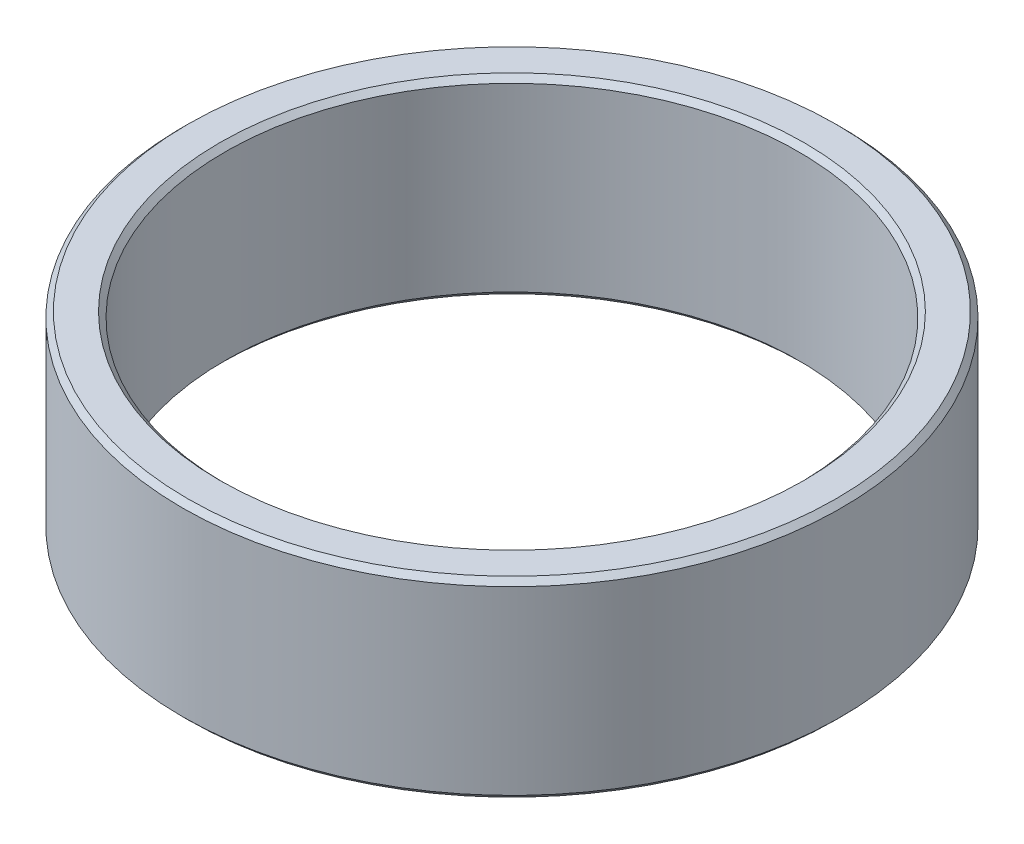
ISO-10303-21;
HEADER;
FILE_DESCRIPTION(('STEP AP214'),'2;1');
FILE_NAME('part.step','',(''),(''),'','','');
FILE_SCHEMA(('AUTOMOTIVE_DESIGN { 1 0 10303 214 1 1 1 1 }'));
ENDSEC;
DATA;
#1=APPLICATION_CONTEXT('core data for automotive mechanical design processes');
#2=APPLICATION_PROTOCOL_DEFINITION('international standard','automotive_design',2000,#1);
#3=PRODUCT_CONTEXT('',#1,'mechanical');
#4=PRODUCT('Part','Part','',(#3));
#5=PRODUCT_RELATED_PRODUCT_CATEGORY('part','',(#4));
#6=PRODUCT_DEFINITION_FORMATION('','',#4);
#7=PRODUCT_DEFINITION_CONTEXT('part definition',#1,'design');
#8=PRODUCT_DEFINITION('design','',#6,#7);
#9=PRODUCT_DEFINITION_SHAPE('','',#8);
#10=(LENGTH_UNIT() NAMED_UNIT(*) SI_UNIT(.MILLI.,.METRE.));
#11=(NAMED_UNIT(*) PLANE_ANGLE_UNIT() SI_UNIT($,.RADIAN.));
#12=(NAMED_UNIT(*) SI_UNIT($,.STERADIAN.) SOLID_ANGLE_UNIT());
#13=UNCERTAINTY_MEASURE_WITH_UNIT(LENGTH_MEASURE(1.E-05),#10,'distance_accuracy_value','');
#14=(GEOMETRIC_REPRESENTATION_CONTEXT(3) GLOBAL_UNCERTAINTY_ASSIGNED_CONTEXT((#13)) GLOBAL_UNIT_ASSIGNED_CONTEXT((#10,
#11,#12)) REPRESENTATION_CONTEXT('',''));
#15=CARTESIAN_POINT('',(0.,0.,0.));
#16=DIRECTION('',(0.,0.,1.));
#17=DIRECTION('',(1.,0.,0.));
#18=AXIS2_PLACEMENT_3D('',#15,#16,#17);
#19=CARTESIAN_POINT('',(0.,18.,0.));
#20=DIRECTION('',(0.,1.,0.));
#21=DIRECTION('',(0.,0.,1.));
#22=AXIS2_PLACEMENT_3D('',#19,#20,#21);
#23=PLANE('',#22);
#24=CARTESIAN_POINT('',(0.,18.,0.));
#25=DIRECTION('',(0.,1.,0.));
#26=DIRECTION('',(0.,0.,1.));
#27=AXIS2_PLACEMENT_3D('',#24,#25,#26);
#28=CIRCLE('',#27,27.5);
#29=CARTESIAN_POINT('',(0.,18.,27.5));
#30=VERTEX_POINT('',#29);
#31=EDGE_CURVE('E10',#30,#30,#28,.F.);
#32=ORIENTED_EDGE('',*,*,#31,.T.);
#33=EDGE_LOOP('',(#32));
#34=FACE_BOUND('',#33,.T.);
#35=CARTESIAN_POINT('',(0.,18.,0.));
#36=DIRECTION('',(0.,1.,0.));
#37=DIRECTION('',(0.,0.,1.));
#38=AXIS2_PLACEMENT_3D('',#35,#36,#37);
#39=CIRCLE('',#38,30.5);
#40=CARTESIAN_POINT('',(0.,18.,30.5));
#41=VERTEX_POINT('',#40);
#42=EDGE_CURVE('E38',#41,#41,#39,.T.);
#43=ORIENTED_EDGE('',*,*,#42,.T.);
#44=EDGE_LOOP('',(#43));
#45=FACE_BOUND('',#44,.T.);
#46=ADVANCED_FACE('F31',(#34,#45),#23,.T.);
#47=CARTESIAN_POINT('',(0.,0.,0.));
#48=DIRECTION('',(0.,1.,0.));
#49=DIRECTION('',(0.,0.,1.));
#50=AXIS2_PLACEMENT_3D('',#47,#48,#49);
#51=PLANE('',#50);
#52=CARTESIAN_POINT('',(0.,0.,0.));
#53=DIRECTION('',(0.,1.,0.));
#54=DIRECTION('',(0.,0.,1.));
#55=AXIS2_PLACEMENT_3D('',#52,#53,#54);
#56=CIRCLE('',#55,27.5);
#57=CARTESIAN_POINT('',(0.,0.,27.5));
#58=VERTEX_POINT('',#57);
#59=EDGE_CURVE('E57',#58,#58,#56,.T.);
#60=ORIENTED_EDGE('',*,*,#59,.T.);
#61=EDGE_LOOP('',(#60));
#62=FACE_BOUND('',#61,.T.);
#63=CARTESIAN_POINT('',(0.,0.,0.));
#64=DIRECTION('',(0.,1.,0.));
#65=DIRECTION('',(0.,0.,1.));
#66=AXIS2_PLACEMENT_3D('',#63,#64,#65);
#67=CIRCLE('',#66,30.5);
#68=CARTESIAN_POINT('',(0.,0.,30.5));
#69=VERTEX_POINT('',#68);
#70=EDGE_CURVE('E60',#69,#69,#67,.F.);
#71=ORIENTED_EDGE('',*,*,#70,.T.);
#72=EDGE_LOOP('',(#71));
#73=FACE_BOUND('',#72,.T.);
#74=ADVANCED_FACE('F64',(#62,#73),#51,.F.);
#75=CARTESIAN_POINT('',(0.,18.,0.));
#76=DIRECTION('',(0.,-1.,0.));
#77=DIRECTION('',(0.,0.,-1.));
#78=AXIS2_PLACEMENT_3D('',#75,#76,#77);
#79=CYLINDRICAL_SURFACE('',#78,31.);
#80=CARTESIAN_POINT('',(0.,0.500000000000011,0.));
#81=DIRECTION('',(0.,1.,0.));
#82=DIRECTION('',(0.,0.,1.));
#83=AXIS2_PLACEMENT_3D('',#80,#81,#82);
#84=CIRCLE('',#83,31.);
#85=CARTESIAN_POINT('',(0.,0.500000000000011,31.));
#86=VERTEX_POINT('',#85);
#87=EDGE_CURVE('E42',#86,#86,#84,.T.);
#88=ORIENTED_EDGE('',*,*,#87,.T.);
#89=EDGE_LOOP('',(#88));
#90=FACE_BOUND('',#89,.T.);
#91=CARTESIAN_POINT('',(0.,17.5,0.));
#92=DIRECTION('',(0.,1.,0.));
#93=DIRECTION('',(0.,0.,1.));
#94=AXIS2_PLACEMENT_3D('',#91,#92,#93);
#95=CIRCLE('',#94,31.);
#96=CARTESIAN_POINT('',(0.,17.5,31.));
#97=VERTEX_POINT('',#96);
#98=EDGE_CURVE('E46',#97,#97,#95,.F.);
#99=ORIENTED_EDGE('',*,*,#98,.T.);
#100=EDGE_LOOP('',(#99));
#101=FACE_BOUND('',#100,.T.);
#102=ADVANCED_FACE('F74',(#90,#101),#79,.T.);
#103=CARTESIAN_POINT('',(0.,18.,0.));
#104=DIRECTION('',(0.,-1.,0.));
#105=DIRECTION('',(0.,0.,-1.));
#106=AXIS2_PLACEMENT_3D('',#103,#104,#105);
#107=CYLINDRICAL_SURFACE('',#106,27.);
#108=CARTESIAN_POINT('',(0.,0.500000000000004,0.));
#109=DIRECTION('',(0.,1.,0.));
#110=DIRECTION('',(0.,0.,1.));
#111=AXIS2_PLACEMENT_3D('',#108,#109,#110);
#112=CIRCLE('',#111,27.);
#113=CARTESIAN_POINT('',(0.,0.500000000000004,27.));
#114=VERTEX_POINT('',#113);
#115=EDGE_CURVE('E51',#114,#114,#112,.F.);
#116=ORIENTED_EDGE('',*,*,#115,.T.);
#117=EDGE_LOOP('',(#116));
#118=FACE_BOUND('',#117,.T.);
#119=CARTESIAN_POINT('',(0.,17.5,0.));
#120=DIRECTION('',(0.,1.,0.));
#121=DIRECTION('',(0.,0.,1.));
#122=AXIS2_PLACEMENT_3D('',#119,#120,#121);
#123=CIRCLE('',#122,27.);
#124=CARTESIAN_POINT('',(0.,17.5,27.));
#125=VERTEX_POINT('',#124);
#126=EDGE_CURVE('E54',#125,#125,#123,.T.);
#127=ORIENTED_EDGE('',*,*,#126,.T.);
#128=EDGE_LOOP('',(#127));
#129=FACE_BOUND('',#128,.T.);
#130=ADVANCED_FACE('F77',(#118,#129),#107,.F.);
#131=CARTESIAN_POINT('',(0.,0.,0.));
#132=DIRECTION('',(0.,-1.,0.));
#133=DIRECTION('',(0.,0.,-1.));
#134=AXIS2_PLACEMENT_3D('',#131,#132,#133);
#135=CONICAL_SURFACE('',#134,27.5,0.785398163397438);
#136=ORIENTED_EDGE('',*,*,#115,.F.);
#137=EDGE_LOOP('',(#136));
#138=FACE_BOUND('',#137,.T.);
#139=ORIENTED_EDGE('',*,*,#59,.F.);
#140=EDGE_LOOP('',(#139));
#141=FACE_BOUND('',#140,.T.);
#142=ADVANCED_FACE('F70',(#138,#141),#135,.F.);
#143=CARTESIAN_POINT('',(0.,0.500000000000011,0.));
#144=DIRECTION('',(0.,1.,0.));
#145=DIRECTION('',(0.,0.,1.));
#146=AXIS2_PLACEMENT_3D('',#143,#144,#145);
#147=CONICAL_SURFACE('',#146,31.,0.785398163397445);
#148=ORIENTED_EDGE('',*,*,#70,.F.);
#149=EDGE_LOOP('',(#148));
#150=FACE_BOUND('',#149,.T.);
#151=ORIENTED_EDGE('',*,*,#87,.F.);
#152=EDGE_LOOP('',(#151));
#153=FACE_BOUND('',#152,.T.);
#154=ADVANCED_FACE('F66',(#150,#153),#147,.T.);
#155=CARTESIAN_POINT('',(0.,17.5,0.));
#156=DIRECTION('',(0.,1.,0.));
#157=DIRECTION('',(0.,0.,1.));
#158=AXIS2_PLACEMENT_3D('',#155,#156,#157);
#159=CONICAL_SURFACE('',#158,27.,0.785398163397452);
#160=ORIENTED_EDGE('',*,*,#31,.F.);
#161=EDGE_LOOP('',(#160));
#162=FACE_BOUND('',#161,.T.);
#163=ORIENTED_EDGE('',*,*,#126,.F.);
#164=EDGE_LOOP('',(#163));
#165=FACE_BOUND('',#164,.T.);
#166=ADVANCED_FACE('F69',(#162,#165),#159,.F.);
#167=CARTESIAN_POINT('',(0.,18.,0.));
#168=DIRECTION('',(0.,-1.,0.));
#169=DIRECTION('',(0.,0.,-1.));
#170=AXIS2_PLACEMENT_3D('',#167,#168,#169);
#171=CONICAL_SURFACE('',#170,30.5,0.785398163397438);
#172=ORIENTED_EDGE('',*,*,#98,.F.);
#173=EDGE_LOOP('',(#172));
#174=FACE_BOUND('',#173,.T.);
#175=ORIENTED_EDGE('',*,*,#42,.F.);
#176=EDGE_LOOP('',(#175));
#177=FACE_BOUND('',#176,.T.);
#178=ADVANCED_FACE('F33',(#174,#177),#171,.T.);
#179=CLOSED_SHELL('',(#46,#74,#102,#130,#142,#154,#166,#178));
#180=MANIFOLD_SOLID_BREP('B2',#179);
#181=ADVANCED_BREP_SHAPE_REPRESENTATION('',(#18,#180),#14);
#182=SHAPE_DEFINITION_REPRESENTATION(#9,#181);
ENDSEC;
END-ISO-10303-21;
